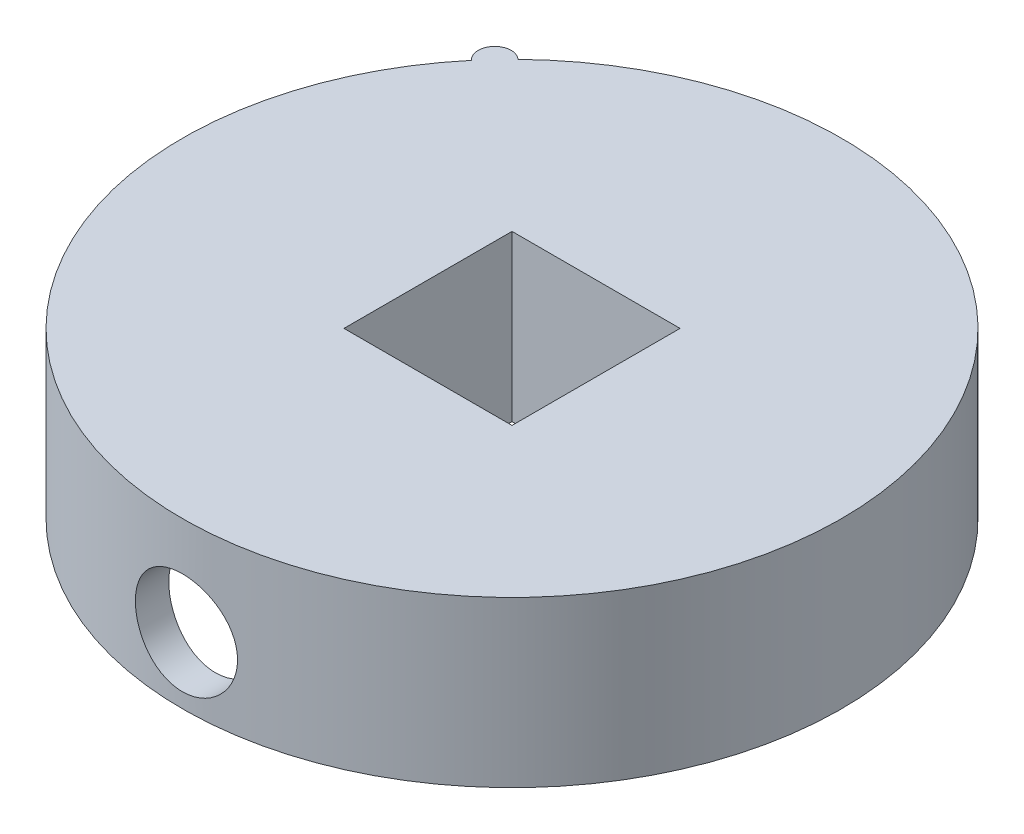
ISO-10303-21;
HEADER;
FILE_DESCRIPTION(('STEP AP214'),'2;1');
FILE_NAME('part.step','',(''),(''),'','','');
FILE_SCHEMA(('AUTOMOTIVE_DESIGN { 1 0 10303 214 1 1 1 1 }'));
ENDSEC;
DATA;
#1=APPLICATION_CONTEXT('core data for automotive mechanical design processes');
#2=APPLICATION_PROTOCOL_DEFINITION('international standard','automotive_design',2000,#1);
#3=PRODUCT_CONTEXT('',#1,'mechanical');
#4=PRODUCT('Part','Part','',(#3));
#5=PRODUCT_RELATED_PRODUCT_CATEGORY('part','',(#4));
#6=PRODUCT_DEFINITION_FORMATION('','',#4);
#7=PRODUCT_DEFINITION_CONTEXT('part definition',#1,'design');
#8=PRODUCT_DEFINITION('design','',#6,#7);
#9=PRODUCT_DEFINITION_SHAPE('','',#8);
#10=(LENGTH_UNIT() NAMED_UNIT(*) SI_UNIT(.MILLI.,.METRE.));
#11=(NAMED_UNIT(*) PLANE_ANGLE_UNIT() SI_UNIT($,.RADIAN.));
#12=(NAMED_UNIT(*) SI_UNIT($,.STERADIAN.) SOLID_ANGLE_UNIT());
#13=UNCERTAINTY_MEASURE_WITH_UNIT(LENGTH_MEASURE(1.E-05),#10,'distance_accuracy_value','');
#14=(GEOMETRIC_REPRESENTATION_CONTEXT(3) GLOBAL_UNCERTAINTY_ASSIGNED_CONTEXT((#13)) GLOBAL_UNIT_ASSIGNED_CONTEXT((#10,
#11,#12)) REPRESENTATION_CONTEXT('',''));
#15=CARTESIAN_POINT('',(0.,0.,0.));
#16=DIRECTION('',(0.,0.,1.));
#17=DIRECTION('',(1.,0.,0.));
#18=AXIS2_PLACEMENT_3D('',#15,#16,#17);
#19=CARTESIAN_POINT('',(0.,10.,0.));
#20=DIRECTION('',(0.,-1.,0.));
#21=DIRECTION('',(0.,0.,-1.));
#22=AXIS2_PLACEMENT_3D('',#19,#20,#21);
#23=CYLINDRICAL_SURFACE('',#22,20.);
#24=CARTESIAN_POINT('',(0.,10.,0.));
#25=DIRECTION('',(0.,1.,0.));
#26=DIRECTION('',(0.,0.,1.));
#27=AXIS2_PLACEMENT_3D('',#24,#25,#26);
#28=CIRCLE('',#27,20.);
#29=CARTESIAN_POINT('',(-15.3208888623795,10.,-12.8557521937308));
#30=VERTEX_POINT('',#29);
#31=CARTESIAN_POINT('',(-13.960317173332,10.,-14.3216460094491));
#32=VERTEX_POINT('',#31);
#33=EDGE_CURVE('E11',#30,#32,#28,.T.);
#34=ORIENTED_EDGE('',*,*,#33,.F.);
#35=DIRECTION('',(0.,1.,0.));
#36=VECTOR('',#35,1.);
#37=CARTESIAN_POINT('',(-15.3208888623796,-2.41380726338418,-12.8557521937307));
#38=LINE('',#37,#36);
#39=CARTESIAN_POINT('',(-15.3208888623796,0.,-12.8557521937307));
#40=VERTEX_POINT('',#39);
#41=EDGE_CURVE('E111',#40,#30,#38,.T.);
#42=ORIENTED_EDGE('',*,*,#41,.F.);
#43=CARTESIAN_POINT('',(0.,0.,0.));
#44=DIRECTION('',(0.,1.,0.));
#45=DIRECTION('',(0.,0.,1.));
#46=AXIS2_PLACEMENT_3D('',#43,#44,#45);
#47=CIRCLE('',#46,20.);
#48=CARTESIAN_POINT('',(-13.960317173332,0.,-14.3216460094491));
#49=VERTEX_POINT('',#48);
#50=EDGE_CURVE('E38',#40,#49,#47,.T.);
#51=ORIENTED_EDGE('',*,*,#50,.T.);
#52=DIRECTION('',(0.,1.,0.));
#53=VECTOR('',#52,1.);
#54=CARTESIAN_POINT('',(-13.9603171733319,-2.41380726338418,-14.3216460094492));
#55=LINE('',#54,#53);
#56=EDGE_CURVE('E52',#49,#32,#55,.T.);
#57=ORIENTED_EDGE('',*,*,#56,.T.);
#58=EDGE_LOOP('',(#34,#42,#51,#57));
#59=FACE_BOUND('',#58,.T.);
#60=CARTESIAN_POINT('',(0.,0.9,20.));
#61=CARTESIAN_POINT('',(0.173016557974578,0.900007080795432,19.9999971650391));
#62=CARTESIAN_POINT('',(0.34613178639695,0.914533455175428,19.9977314078076));
#63=CARTESIAN_POINT('',(0.687518635637837,0.972237701724927,19.9889109487694));
#64=CARTESIAN_POINT('',(0.855785454793477,1.01544302312093,19.9823521380743));
#65=CARTESIAN_POINT('',(1.18248593303596,1.1291791256332,19.9656822285072));
#66=CARTESIAN_POINT('',(1.34092709214203,1.19968875969523,19.9555738792985));
#67=CARTESIAN_POINT('',(1.64370610687182,1.36597920536802,19.9329202594809));
#68=CARTESIAN_POINT('',(1.78804581720928,1.46175668743951,19.9203753099998));
#69=CARTESIAN_POINT('',(2.05974845786461,1.67671260326108,19.8941255745019));
#70=CARTESIAN_POINT('',(2.18697707204052,1.79605986049788,19.8804128527335));
#71=CARTESIAN_POINT('',(2.4196867060257,2.05440416109371,19.85343479463));
#72=CARTESIAN_POINT('',(2.52516644076686,2.19340236474357,19.8401694847697));
#73=CARTESIAN_POINT('',(2.71191152805789,2.48801131649957,19.8155112551125));
#74=CARTESIAN_POINT('',(2.79304608511286,2.64370590555726,19.8041285915852));
#75=CARTESIAN_POINT('',(2.92796168702672,2.96671880338056,19.7846333252768));
#76=CARTESIAN_POINT('',(2.98174432506344,3.13403643448893,19.7765205320398));
#77=CARTESIAN_POINT('',(3.06001047470206,3.47412991875066,19.7645618858971));
#78=CARTESIAN_POINT('',(3.08472451807274,3.64685151766504,19.7606824776643));
#79=CARTESIAN_POINT('',(3.1048662780187,3.99403042740349,19.7575280822113));
#80=CARTESIAN_POINT('',(3.10029578872548,4.16848763124104,19.758252812916));
#81=CARTESIAN_POINT('',(3.06218643754866,4.5125521067266,19.7641941390446));
#82=CARTESIAN_POINT('',(3.02890496858939,4.68218867658666,19.7693708216034));
#83=CARTESIAN_POINT('',(2.93472161326262,5.01344040797057,19.783570384335));
#84=CARTESIAN_POINT('',(2.87381889722358,5.17505532838282,19.7925933800408));
#85=CARTESIAN_POINT('',(2.72585610559503,5.48645559505007,19.8135127113495));
#86=CARTESIAN_POINT('',(2.63868762651754,5.6361886031537,19.8254209140239));
#87=CARTESIAN_POINT('',(2.44074483457386,5.91899998169321,19.8507604280544));
#88=CARTESIAN_POINT('',(2.32996886913798,6.05207718515487,19.8641918460077));
#89=CARTESIAN_POINT('',(2.0865457846287,6.29929060689683,19.8912404778778));
#90=CARTESIAN_POINT('',(1.95367749855783,6.41320911235008,19.9048581429418));
#91=CARTESIAN_POINT('',(1.67059352836411,6.61716458384982,19.9306117241799));
#92=CARTESIAN_POINT('',(1.52037775867124,6.70720143208794,19.9427476330443));
#93=CARTESIAN_POINT('',(1.20666955981141,6.86085145308918,19.9641842572175));
#94=CARTESIAN_POINT('',(1.04316842223976,6.92444712418766,19.973483093561));
#95=CARTESIAN_POINT('',(0.707630368591965,7.02321658476251,19.9881823322231));
#96=CARTESIAN_POINT('',(0.535594070043371,7.05839242726859,19.9935830161389));
#97=CARTESIAN_POINT('',(0.18974745321463,7.09903258858386,19.999839979177));
#98=CARTESIAN_POINT('',(0.0159730895823901,7.10479609111716,20.0007420165939));
#99=CARTESIAN_POINT('',(-0.330059915144203,7.08724310983438,19.9980248327243));
#100=CARTESIAN_POINT('',(-0.5023186062509,7.06392758918426,19.9944057611877));
#101=CARTESIAN_POINT('',(-0.839519062554434,6.98912721291357,19.9830813062526));
#102=CARTESIAN_POINT('',(-1.00449408808775,6.93778880133858,19.9753971727289));
#103=CARTESIAN_POINT('',(-1.32349525981676,6.80855487063498,19.9568011840378));
#104=CARTESIAN_POINT('',(-1.4775208615223,6.73065803193059,19.9458891684944));
#105=CARTESIAN_POINT('',(-1.7715619191957,6.54982138344464,19.9219357385274));
#106=CARTESIAN_POINT('',(-1.91145985994471,6.44669262669295,19.9088785142824));
#107=CARTESIAN_POINT('',(-2.17206987835387,6.21858173575031,19.8821353568535));
#108=CARTESIAN_POINT('',(-2.29278076018428,6.09359824048571,19.8684493845514));
#109=CARTESIAN_POINT('',(-2.51268466926641,5.82399085535137,19.8418452953327));
#110=CARTESIAN_POINT('',(-2.61167667299673,5.67920210042096,19.8289350943909));
#111=CARTESIAN_POINT('',(-2.78393359428538,5.37487547615815,19.805486686096));
#112=CARTESIAN_POINT('',(-2.85719924335206,5.21533802635611,19.7949484113023));
#113=CARTESIAN_POINT('',(-2.97561529141455,4.88663129933381,19.7774949611492));
#114=CARTESIAN_POINT('',(-3.02086981632308,4.71750027657163,19.7705663828432));
#115=CARTESIAN_POINT('',(-3.08230938314147,4.37392249209178,19.7610817453396));
#116=CARTESIAN_POINT('',(-3.09849658118311,4.1994761256275,19.7585253618258));
#117=CARTESIAN_POINT('',(-3.10128813555182,3.85222422779024,19.7580872149381));
#118=CARTESIAN_POINT('',(-3.08820865954259,3.67942121854002,19.7601554912251));
#119=CARTESIAN_POINT('',(-3.03351744801726,3.33850471906413,19.7686247773595));
#120=CARTESIAN_POINT('',(-2.99190577093735,3.17039121923471,19.7750257783332));
#121=CARTESIAN_POINT('',(-2.88144589881863,2.84372354234137,19.791421373363));
#122=CARTESIAN_POINT('',(-2.81262129276619,2.68516122283937,19.801412854401));
#123=CARTESIAN_POINT('',(-2.64972096024408,2.3817828432796,19.8238671717296));
#124=CARTESIAN_POINT('',(-2.55564426248003,2.23696731226727,19.836330103077));
#125=CARTESIAN_POINT('',(-2.34376738116094,1.96358948224111,19.862483054043));
#126=CARTESIAN_POINT('',(-2.22573346513276,1.83520939110733,19.876184362017));
#127=CARTESIAN_POINT('',(-1.96978661876277,1.59996736742,19.903177261943));
#128=CARTESIAN_POINT('',(-1.8318690851942,1.49311043142968,19.9164687581527));
#129=CARTESIAN_POINT('',(-1.53910930505027,1.30338057555414,19.9412344524066));
#130=CARTESIAN_POINT('',(-1.38417199504349,1.22065289513756,19.9526974646132));
#131=CARTESIAN_POINT('',(-1.06249346622742,1.08252095182279,19.9724052696854));
#132=CARTESIAN_POINT('',(-0.895764538907991,1.02708870280286,19.9806533570105));
#133=CARTESIAN_POINT('',(-0.606929877005346,0.957540053066292,19.9911430658503));
#134=CARTESIAN_POINT('',(-0.486597179715198,0.935995962038425,19.9944471586378));
#135=CARTESIAN_POINT('',(-0.244192691603641,0.907223534809589,19.9988766112674));
#136=CARTESIAN_POINT('',(-0.122120924673141,0.899995002135659,20.000002001011));
#137=CARTESIAN_POINT('',(0.,0.9,20.));
#138=B_SPLINE_CURVE_WITH_KNOTS('',3,(#60,#61,#62,#63,#64,#65,#66,#67,#68,#69,#70,#71,#72,#73,
#74,#75,#76,#77,#78,#79,#80,#81,#82,#83,#84,#85,#86,#87,#88,#89,#90,#91,#92,#93,#94,#95,#96,#97,
#98,#99,#100,#101,#102,#103,#104,#105,#106,#107,#108,#109,#110,#111,#112,#113,#114,#115,#116,
#117,#118,#119,#120,#121,#122,#123,#124,#125,#126,#127,#128,#129,#130,#131,#132,#133,#134,#135,
#136,#137),.UNSPECIFIED.,.T.,.F.,(4,2,2,2,2,2,2,2,2,2,2,2,2,2,2,2,2,2,2,2,2,2,2,2,2,2,2,2,2,2,2,
2,2,2,2,2,2,2,4),(0.,0.518603389696483,1.03770386276341,1.55640309660684,2.07503401566504,
2.59752406878385,3.12004498524092,3.64532487300955,4.17057416109137,4.69162919625163,
5.21265230902045,5.72905244255467,6.24546808845431,6.76404496609117,7.28265815704321,
7.80681594553428,8.33097631965123,8.85548309023761,9.3799519674113,9.89907513525496,
10.4181811089692,10.9345999175123,11.4510443884596,11.9714813947096,12.4919508243877,
13.0170514007104,13.5421370450079,14.0652588749373,14.5883418995712,15.105801374666,
15.6232597899663,16.1402706366429,16.6573013724327,17.1796423654186,17.7021044795559,
18.2276494116379,18.7526543724209,19.1187071678768,19.4847549394298),.UNSPECIFIED.);
#139=CARTESIAN_POINT('',(0.,0.9,20.));
#140=VERTEX_POINT('',#139);
#141=EDGE_CURVE('E122',#140,#140,#138,.T.);
#142=ORIENTED_EDGE('',*,*,#141,.F.);
#143=EDGE_LOOP('',(#142));
#144=FACE_BOUND('',#143,.T.);
#145=ADVANCED_FACE('F34',(#59,#144),#23,.T.);
#146=CARTESIAN_POINT('',(0.,10.,0.));
#147=DIRECTION('',(0.,-1.,0.));
#148=DIRECTION('',(0.,0.,-1.));
#149=AXIS2_PLACEMENT_3D('',#146,#147,#148);
#150=CYLINDRICAL_SURFACE('',#149,18.);
#151=CARTESIAN_POINT('',(0.,0.,0.));
#152=DIRECTION('',(0.,1.,0.));
#153=DIRECTION('',(0.,0.,1.));
#154=AXIS2_PLACEMENT_3D('',#151,#152,#153);
#155=CIRCLE('',#154,18.);
#156=CARTESIAN_POINT('',(0.,0.,18.));
#157=VERTEX_POINT('',#156);
#158=EDGE_CURVE('E161',#157,#157,#155,.T.);
#159=ORIENTED_EDGE('',*,*,#158,.F.);
#160=EDGE_LOOP('',(#159));
#161=FACE_BOUND('',#160,.T.);
#162=CARTESIAN_POINT('',(0.,8.,0.));
#163=DIRECTION('',(0.,1.,0.));
#164=DIRECTION('',(0.,0.,1.));
#165=AXIS2_PLACEMENT_3D('',#162,#163,#164);
#166=CIRCLE('',#165,18.);
#167=CARTESIAN_POINT('',(0.,8.,18.));
#168=VERTEX_POINT('',#167);
#169=EDGE_CURVE('E165',#168,#168,#166,.T.);
#170=ORIENTED_EDGE('',*,*,#169,.T.);
#171=EDGE_LOOP('',(#170));
#172=FACE_BOUND('',#171,.T.);
#173=CARTESIAN_POINT('',(-3.1,4.,17.7310462184272));
#174=CARTESIAN_POINT('',(-3.09999313298625,3.82726272069094,17.7310494042664));
#175=CARTESIAN_POINT('',(-3.08551325830219,3.65443324166269,17.73359781963));
#176=CARTESIAN_POINT('',(-3.02800504284677,3.3136297172631,17.7435059787685));
#177=CARTESIAN_POINT('',(-2.98495091441744,3.14566020093493,17.7508700684992));
#178=CARTESIAN_POINT('',(-2.87164044523443,2.81955782532416,17.7695513490921));
#179=CARTESIAN_POINT('',(-2.80140750244069,2.66141664047294,17.7808651388806));
#180=CARTESIAN_POINT('',(-2.63579233362493,2.35917772393653,17.8061670210701));
#181=CARTESIAN_POINT('',(-2.54041271452993,2.21507853865303,17.8201548362166));
#182=CARTESIAN_POINT('',(-2.32614184855305,1.94348302334085,17.8493930596395));
#183=CARTESIAN_POINT('',(-2.20703766109128,1.81615581205768,17.8646541168498));
#184=CARTESIAN_POINT('',(-1.94915880252542,1.58318869594025,17.8946248323828));
#185=CARTESIAN_POINT('',(-1.8103829352717,1.47755011085444,17.9093344571066));
#186=CARTESIAN_POINT('',(-1.51600028932563,1.29032070282335,17.936657998033));
#187=CARTESIAN_POINT('',(-1.36029165213239,1.20888781717709,17.9492579257511));
#188=CARTESIAN_POINT('',(-1.03715174208675,1.07339715212286,17.9708237164532));
#189=CARTESIAN_POINT('',(-0.869721283594248,1.01933747313718,17.979789831599));
#190=CARTESIAN_POINT('',(-0.529639199316319,0.94064653169822,17.9930025721505));
#191=CARTESIAN_POINT('',(-0.35705518468448,0.91573085034474,17.9972947816215));
#192=CARTESIAN_POINT('',(-0.0101065543135215,0.89515029007298,18.0008328399529));
#193=CARTESIAN_POINT('',(0.164257931654621,0.899483294323953,18.0000790540098));
#194=CARTESIAN_POINT('',(0.507871793120614,0.9370562397458,17.9936460189792));
#195=CARTESIAN_POINT('',(0.677155759346085,0.969990051732044,17.988018933082));
#196=CARTESIAN_POINT('',(1.00775822133334,1.06334715589263,17.9725297958012));
#197=CARTESIAN_POINT('',(1.16907646161652,1.12377132911018,17.9626676086866));
#198=CARTESIAN_POINT('',(1.48007290317722,1.27069494452743,17.9397279725034));
#199=CARTESIAN_POINT('',(1.62969078748866,1.35731956202935,17.9266351452942));
#200=CARTESIAN_POINT('',(1.91238214853264,1.5540932748335,17.898687174683));
#201=CARTESIAN_POINT('',(2.04545419633083,1.66424439970646,17.8838318792866));
#202=CARTESIAN_POINT('',(2.29308650989974,1.90663949916695,17.8537823097114));
#203=CARTESIAN_POINT('',(2.40738472323858,2.03915111084635,17.838586137045));
#204=CARTESIAN_POINT('',(2.61216854846296,2.32160652946511,17.8097530244593));
#205=CARTESIAN_POINT('',(2.70265391082531,2.47155051904609,17.7961161008794));
#206=CARTESIAN_POINT('',(2.85730087370296,2.78492932747192,17.7719440497841));
#207=CARTESIAN_POINT('',(2.92142926062609,2.94838085830812,17.7614128406061));
#208=CARTESIAN_POINT('',(3.02124489556565,3.28395857625857,17.7447080955585));
#209=CARTESIAN_POINT('',(3.05693482896464,3.45608394268864,17.7385341482481));
#210=CARTESIAN_POINT('',(3.09848798719902,3.80177395904009,17.7313230529256));
#211=CARTESIAN_POINT('',(3.10472551762942,3.9752923138647,17.7302214459032));
#212=CARTESIAN_POINT('',(3.08819578605888,4.32089297696119,17.7331078649149));
#213=CARTESIAN_POINT('',(3.06542972381246,4.49297534433735,17.7370956804214));
#214=CARTESIAN_POINT('',(2.99185875873464,4.82961966631278,17.7496519386929));
#215=CARTESIAN_POINT('',(2.94124583341696,4.99422485025197,17.7581890061732));
#216=CARTESIAN_POINT('',(2.81361979825464,5.31261748550005,17.7788553503244));
#217=CARTESIAN_POINT('',(2.73660501354011,5.46640424976855,17.7909848548842));
#218=CARTESIAN_POINT('',(2.55748363807944,5.76045617285387,17.8176183967342));
#219=CARTESIAN_POINT('',(2.45513805299021,5.90057370577815,17.8321445840279));
#220=CARTESIAN_POINT('',(2.22858683964253,6.16178043077467,17.8618706165594));
#221=CARTESIAN_POINT('',(2.10437956531447,6.28286818870502,17.8770705124594));
#222=CARTESIAN_POINT('',(1.83596895921044,6.50395300395085,17.9066360445248));
#223=CARTESIAN_POINT('',(1.6915581469289,6.60369989266837,17.9209904913054));
#224=CARTESIAN_POINT('',(1.38781145578617,6.77751584823228,17.9470660891861));
#225=CARTESIAN_POINT('',(1.2284760847549,6.8515857883715,17.9587873298389));
#226=CARTESIAN_POINT('',(0.900133060857951,6.97155973486499,17.9782273472964));
#227=CARTESIAN_POINT('',(0.731173614747658,7.0175925824532,17.9859644071876));
#228=CARTESIAN_POINT('',(0.387777506000827,7.08059964069153,17.996641785183));
#229=CARTESIAN_POINT('',(0.213341327330556,7.09757641164158,17.9995825259176));
#230=CARTESIAN_POINT('',(-0.133646085689154,7.10191176659875,18.0003293291214));
#231=CARTESIAN_POINT('',(-0.306192548851938,7.08965025784471,17.9982012535989));
#232=CARTESIAN_POINT('',(-0.646729000742405,7.03668147658913,17.9891845992446));
#233=CARTESIAN_POINT('',(-0.814719019304073,6.99597439038589,17.9822960515906));
#234=CARTESIAN_POINT('',(-1.14121455109152,6.88741952012266,17.9645302874585));
#235=CARTESIAN_POINT('',(-1.29973179471327,6.81960613815113,17.9536581282528));
#236=CARTESIAN_POINT('',(-1.60319648346798,6.65880671706889,17.9291094270097));
#237=CARTESIAN_POINT('',(-1.74814321499517,6.5658193551832,17.9154327376165));
#238=CARTESIAN_POINT('',(-2.02226104621523,6.35597463562083,17.8865791500137));
#239=CARTESIAN_POINT('',(-2.1512181870935,6.23883999122012,17.8713859895924));
#240=CARTESIAN_POINT('',(-2.38777968814283,5.98460626618822,17.8413218089942));
#241=CARTESIAN_POINT('',(-2.49537903835792,5.84750251439415,17.8264508651275));
#242=CARTESIAN_POINT('',(-2.68692820643402,5.55598003634335,17.7985921888736));
#243=CARTESIAN_POINT('',(-2.77069172773889,5.40143742750927,17.7856196566342));
#244=CARTESIAN_POINT('',(-2.91093883284905,5.08031080000741,17.7632069636885));
#245=CARTESIAN_POINT('',(-2.96744928842572,4.9137388295448,17.7537633255382));
#246=CARTESIAN_POINT('',(-3.03951297941637,4.62213034763268,17.7415403224668));
#247=CARTESIAN_POINT('',(-3.06215859815304,4.49884552094047,17.7376272886697));
#248=CARTESIAN_POINT('',(-3.09240444505106,4.25038992086438,17.7323791080338));
#249=CARTESIAN_POINT('',(-3.10000497797507,4.12521918573439,17.7310439089767));
#250=CARTESIAN_POINT('',(-3.1,4.,17.7310462184272));
#251=B_SPLINE_CURVE_WITH_KNOTS('',3,(#173,#174,#175,#176,#177,#178,#179,#180,#181,#182,#183,
#184,#185,#186,#187,#188,#189,#190,#191,#192,#193,#194,#195,#196,#197,#198,#199,#200,#201,#202,
#203,#204,#205,#206,#207,#208,#209,#210,#211,#212,#213,#214,#215,#216,#217,#218,#219,#220,#221,
#222,#223,#224,#225,#226,#227,#228,#229,#230,#231,#232,#233,#234,#235,#236,#237,#238,#239,#240,
#241,#242,#243,#244,#245,#246,#247,#248,#249,#250),.UNSPECIFIED.,.T.,.F.,(4,2,2,2,2,2,2,2,2,2,2,
2,2,2,2,2,2,2,2,2,2,2,2,2,2,2,2,2,2,2,2,2,2,2,2,2,2,2,4),(0.,0.517753850761574,1.03597559993478,
1.55375220630103,2.07147515645401,2.59407326128228,3.11670315667935,3.64267180628803,
4.16860395102849,4.68935948381991,5.21007732809709,5.72528941141336,6.24051800801167,
6.75824812295139,7.27602291917712,7.80050309565845,8.32498876769148,8.85013335577677,
9.37522834969941,9.89363170722258,10.4120136213134,10.9268657713359,11.4417505883749,
11.961692000747,12.4816725787187,13.0074499206043,13.5332093786423,14.0565341726182,
14.5798128510276,15.0963294394443,15.6128426450766,16.128702386328,16.6445892388609,
17.1667678336015,17.6890687728398,18.2153463288493,18.7411039040315,19.1164370642766,
19.4917626214611),.UNSPECIFIED.);
#252=CARTESIAN_POINT('',(-3.1,4.,17.7310462184272));
#253=VERTEX_POINT('',#252);
#254=EDGE_CURVE('E119',#253,#253,#251,.T.);
#255=ORIENTED_EDGE('',*,*,#254,.T.);
#256=EDGE_LOOP('',(#255));
#257=FACE_BOUND('',#256,.T.);
#258=ADVANCED_FACE('F134',(#161,#172,#257),#150,.F.);
#259=CARTESIAN_POINT('',(0.,0.,0.));
#260=DIRECTION('',(0.,1.,0.));
#261=DIRECTION('',(0.,0.,1.));
#262=AXIS2_PLACEMENT_3D('',#259,#260,#261);
#263=PLANE('',#262);
#264=DIRECTION('',(0.,0.,-1.));
#265=VECTOR('',#264,1.);
#266=CARTESIAN_POINT('',(-7.1,0.,5.1));
#267=LINE('',#266,#265);
#268=CARTESIAN_POINT('',(-7.1,0.,7.1));
#269=VERTEX_POINT('',#268);
#270=CARTESIAN_POINT('',(-7.1,0.,-7.1));
#271=VERTEX_POINT('',#270);
#272=EDGE_CURVE('E170',#269,#271,#267,.T.);
#273=ORIENTED_EDGE('',*,*,#272,.T.);
#274=DIRECTION('',(1.,0.,0.));
#275=VECTOR('',#274,1.);
#276=CARTESIAN_POINT('',(5.1,0.,-7.1));
#277=LINE('',#276,#275);
#278=CARTESIAN_POINT('',(7.1,0.,-7.1));
#279=VERTEX_POINT('',#278);
#280=EDGE_CURVE('E172',#271,#279,#277,.T.);
#281=ORIENTED_EDGE('',*,*,#280,.T.);
#282=DIRECTION('',(0.,0.,1.));
#283=VECTOR('',#282,1.);
#284=CARTESIAN_POINT('',(7.1,0.,5.1));
#285=LINE('',#284,#283);
#286=CARTESIAN_POINT('',(7.1,0.,7.1));
#287=VERTEX_POINT('',#286);
#288=EDGE_CURVE('E177',#279,#287,#285,.T.);
#289=ORIENTED_EDGE('',*,*,#288,.T.);
#290=DIRECTION('',(-1.,0.,0.));
#291=VECTOR('',#290,1.);
#292=CARTESIAN_POINT('',(5.1,0.,7.1));
#293=LINE('',#292,#291);
#294=EDGE_CURVE('E182',#287,#269,#293,.T.);
#295=ORIENTED_EDGE('',*,*,#294,.T.);
#296=EDGE_LOOP('',(#273,#281,#289,#295));
#297=FACE_BOUND('',#296,.T.);
#298=DIRECTION('',(1.,0.,0.));
#299=VECTOR('',#298,1.);
#300=CARTESIAN_POINT('',(5.1,0.,-5.1));
#301=LINE('',#300,#299);
#302=CARTESIAN_POINT('',(-5.1,0.,-5.1));
#303=VERTEX_POINT('',#302);
#304=CARTESIAN_POINT('',(5.1,0.,-5.1));
#305=VERTEX_POINT('',#304);
#306=EDGE_CURVE('E203',#303,#305,#301,.T.);
#307=ORIENTED_EDGE('',*,*,#306,.F.);
#308=DIRECTION('',(0.,0.,-1.));
#309=VECTOR('',#308,1.);
#310=CARTESIAN_POINT('',(-5.1,0.,5.1));
#311=LINE('',#310,#309);
#312=CARTESIAN_POINT('',(-5.1,0.,5.1));
#313=VERTEX_POINT('',#312);
#314=EDGE_CURVE('E201',#313,#303,#311,.T.);
#315=ORIENTED_EDGE('',*,*,#314,.F.);
#316=DIRECTION('',(-1.,0.,0.));
#317=VECTOR('',#316,1.);
#318=CARTESIAN_POINT('',(5.1,0.,5.1));
#319=LINE('',#318,#317);
#320=CARTESIAN_POINT('',(5.1,0.,5.1));
#321=VERTEX_POINT('',#320);
#322=EDGE_CURVE('E191',#321,#313,#319,.T.);
#323=ORIENTED_EDGE('',*,*,#322,.F.);
#324=DIRECTION('',(0.,0.,1.));
#325=VECTOR('',#324,1.);
#326=CARTESIAN_POINT('',(5.1,0.,5.1));
#327=LINE('',#326,#325);
#328=EDGE_CURVE('E206',#305,#321,#327,.T.);
#329=ORIENTED_EDGE('',*,*,#328,.F.);
#330=EDGE_LOOP('',(#307,#315,#323,#329));
#331=FACE_BOUND('',#330,.T.);
#332=ADVANCED_FACE('F151',(#297,#331),#263,.F.);
#333=CARTESIAN_POINT('',(0.,10.,0.));
#334=DIRECTION('',(0.,1.,0.));
#335=DIRECTION('',(0.,0.,1.));
#336=AXIS2_PLACEMENT_3D('',#333,#334,#335);
#337=PLANE('',#336);
#338=ORIENTED_EDGE('',*,*,#33,.T.);
#339=CARTESIAN_POINT('',(-14.6406030178558,10.,-13.58869910159));
#340=DIRECTION('',(0.,1.,0.));
#341=DIRECTION('',(0.,0.,-1.));
#342=AXIS2_PLACEMENT_3D('',#339,#340,#341);
#343=CIRCLE('',#342,1.);
#344=EDGE_CURVE('E116',#32,#30,#343,.T.);
#345=ORIENTED_EDGE('',*,*,#344,.T.);
#346=EDGE_LOOP('',(#338,#345));
#347=FACE_BOUND('',#346,.T.);
#348=DIRECTION('',(0.,0.,-1.));
#349=VECTOR('',#348,1.);
#350=CARTESIAN_POINT('',(-5.1,10.,5.1));
#351=LINE('',#350,#349);
#352=CARTESIAN_POINT('',(-5.1,10.,5.1));
#353=VERTEX_POINT('',#352);
#354=CARTESIAN_POINT('',(-5.1,10.,-5.1));
#355=VERTEX_POINT('',#354);
#356=EDGE_CURVE('E187',#353,#355,#351,.T.);
#357=ORIENTED_EDGE('',*,*,#356,.T.);
#358=DIRECTION('',(1.,0.,0.));
#359=VECTOR('',#358,1.);
#360=CARTESIAN_POINT('',(5.1,10.,-5.1));
#361=LINE('',#360,#359);
#362=CARTESIAN_POINT('',(5.1,10.,-5.1));
#363=VERTEX_POINT('',#362);
#364=EDGE_CURVE('E190',#355,#363,#361,.T.);
#365=ORIENTED_EDGE('',*,*,#364,.T.);
#366=DIRECTION('',(0.,0.,1.));
#367=VECTOR('',#366,1.);
#368=CARTESIAN_POINT('',(5.1,10.,5.1));
#369=LINE('',#368,#367);
#370=CARTESIAN_POINT('',(5.1,10.,5.1));
#371=VERTEX_POINT('',#370);
#372=EDGE_CURVE('E194',#363,#371,#369,.T.);
#373=ORIENTED_EDGE('',*,*,#372,.T.);
#374=DIRECTION('',(-1.,0.,0.));
#375=VECTOR('',#374,1.);
#376=CARTESIAN_POINT('',(5.1,10.,5.1));
#377=LINE('',#376,#375);
#378=EDGE_CURVE('E197',#371,#353,#377,.T.);
#379=ORIENTED_EDGE('',*,*,#378,.T.);
#380=EDGE_LOOP('',(#357,#365,#373,#379));
#381=FACE_BOUND('',#380,.T.);
#382=ADVANCED_FACE('F156',(#347,#381),#337,.T.);
#383=ORIENTED_EDGE('',*,*,#158,.T.);
#384=EDGE_LOOP('',(#383));
#385=FACE_BOUND('',#384,.T.);
#386=ORIENTED_EDGE('',*,*,#50,.F.);
#387=CARTESIAN_POINT('',(-14.6406030178558,0.,-13.58869910159));
#388=DIRECTION('',(0.,1.,0.));
#389=DIRECTION('',(0.,0.,1.));
#390=AXIS2_PLACEMENT_3D('',#387,#388,#389);
#391=CIRCLE('',#390,1.);
#392=EDGE_CURVE('E109',#40,#49,#391,.F.);
#393=ORIENTED_EDGE('',*,*,#392,.T.);
#394=EDGE_LOOP('',(#386,#393));
#395=FACE_BOUND('',#394,.T.);
#396=ADVANCED_FACE('F107',(#385,#395),#263,.F.);
#397=CARTESIAN_POINT('',(-5.1,10.,5.1));
#398=DIRECTION('',(-1.,0.,0.));
#399=DIRECTION('',(0.,0.,1.));
#400=AXIS2_PLACEMENT_3D('',#397,#398,#399);
#401=PLANE('',#400);
#402=ORIENTED_EDGE('',*,*,#314,.T.);
#403=DIRECTION('',(0.,-1.,0.));
#404=VECTOR('',#403,1.);
#405=CARTESIAN_POINT('',(-5.1,10.,-5.1));
#406=LINE('',#405,#404);
#407=EDGE_CURVE('E200',#355,#303,#406,.T.);
#408=ORIENTED_EDGE('',*,*,#407,.F.);
#409=ORIENTED_EDGE('',*,*,#356,.F.);
#410=DIRECTION('',(0.,-1.,0.));
#411=VECTOR('',#410,1.);
#412=CARTESIAN_POINT('',(-5.1,10.,5.1));
#413=LINE('',#412,#411);
#414=EDGE_CURVE('E110',#353,#313,#413,.T.);
#415=ORIENTED_EDGE('',*,*,#414,.T.);
#416=EDGE_LOOP('',(#402,#408,#409,#415));
#417=FACE_BOUND('',#416,.T.);
#418=ADVANCED_FACE('F232',(#417),#401,.F.);
#419=CARTESIAN_POINT('',(5.1,10.,5.1));
#420=DIRECTION('',(0.,0.,1.));
#421=DIRECTION('',(1.,0.,0.));
#422=AXIS2_PLACEMENT_3D('',#419,#420,#421);
#423=PLANE('',#422);
#424=ORIENTED_EDGE('',*,*,#322,.T.);
#425=ORIENTED_EDGE('',*,*,#414,.F.);
#426=ORIENTED_EDGE('',*,*,#378,.F.);
#427=DIRECTION('',(0.,-1.,0.));
#428=VECTOR('',#427,1.);
#429=CARTESIAN_POINT('',(5.1,10.,5.1));
#430=LINE('',#429,#428);
#431=EDGE_CURVE('E212',#371,#321,#430,.T.);
#432=ORIENTED_EDGE('',*,*,#431,.T.);
#433=EDGE_LOOP('',(#424,#425,#426,#432));
#434=FACE_BOUND('',#433,.T.);
#435=ADVANCED_FACE('F234',(#434),#423,.F.);
#436=CARTESIAN_POINT('',(5.1,10.,5.1));
#437=DIRECTION('',(1.,0.,0.));
#438=DIRECTION('',(0.,0.,-1.));
#439=AXIS2_PLACEMENT_3D('',#436,#437,#438);
#440=PLANE('',#439);
#441=ORIENTED_EDGE('',*,*,#328,.T.);
#442=ORIENTED_EDGE('',*,*,#431,.F.);
#443=ORIENTED_EDGE('',*,*,#372,.F.);
#444=DIRECTION('',(0.,-1.,0.));
#445=VECTOR('',#444,1.);
#446=CARTESIAN_POINT('',(5.1,10.,-5.1));
#447=LINE('',#446,#445);
#448=EDGE_CURVE('E214',#363,#305,#447,.T.);
#449=ORIENTED_EDGE('',*,*,#448,.T.);
#450=EDGE_LOOP('',(#441,#442,#443,#449));
#451=FACE_BOUND('',#450,.T.);
#452=ADVANCED_FACE('F229',(#451),#440,.F.);
#453=CARTESIAN_POINT('',(5.1,10.,-5.1));
#454=DIRECTION('',(0.,0.,-1.));
#455=DIRECTION('',(-1.,0.,0.));
#456=AXIS2_PLACEMENT_3D('',#453,#454,#455);
#457=PLANE('',#456);
#458=ORIENTED_EDGE('',*,*,#306,.T.);
#459=ORIENTED_EDGE('',*,*,#448,.F.);
#460=ORIENTED_EDGE('',*,*,#364,.F.);
#461=ORIENTED_EDGE('',*,*,#407,.T.);
#462=EDGE_LOOP('',(#458,#459,#460,#461));
#463=FACE_BOUND('',#462,.T.);
#464=ADVANCED_FACE('F220',(#463),#457,.F.);
#465=CARTESIAN_POINT('',(0.,8.,0.));
#466=DIRECTION('',(0.,1.,0.));
#467=DIRECTION('',(0.,0.,1.));
#468=AXIS2_PLACEMENT_3D('',#465,#466,#467);
#469=PLANE('',#468);
#470=DIRECTION('',(0.,0.,-1.));
#471=VECTOR('',#470,1.);
#472=CARTESIAN_POINT('',(-7.1,8.,5.1));
#473=LINE('',#472,#471);
#474=CARTESIAN_POINT('',(-7.1,8.,7.1));
#475=VERTEX_POINT('',#474);
#476=CARTESIAN_POINT('',(-7.1,8.,-7.1));
#477=VERTEX_POINT('',#476);
#478=EDGE_CURVE('E184',#475,#477,#473,.T.);
#479=ORIENTED_EDGE('',*,*,#478,.F.);
#480=DIRECTION('',(-1.,0.,0.));
#481=VECTOR('',#480,1.);
#482=CARTESIAN_POINT('',(5.1,8.,7.1));
#483=LINE('',#482,#481);
#484=CARTESIAN_POINT('',(7.1,8.,7.1));
#485=VERTEX_POINT('',#484);
#486=EDGE_CURVE('E271',#485,#475,#483,.T.);
#487=ORIENTED_EDGE('',*,*,#486,.F.);
#488=DIRECTION('',(0.,0.,1.));
#489=VECTOR('',#488,1.);
#490=CARTESIAN_POINT('',(7.1,8.,5.1));
#491=LINE('',#490,#489);
#492=CARTESIAN_POINT('',(7.1,8.,-7.1));
#493=VERTEX_POINT('',#492);
#494=EDGE_CURVE('E274',#493,#485,#491,.T.);
#495=ORIENTED_EDGE('',*,*,#494,.F.);
#496=DIRECTION('',(1.,0.,0.));
#497=VECTOR('',#496,1.);
#498=CARTESIAN_POINT('',(5.1,8.,-7.1));
#499=LINE('',#498,#497);
#500=EDGE_CURVE('E277',#477,#493,#499,.T.);
#501=ORIENTED_EDGE('',*,*,#500,.F.);
#502=EDGE_LOOP('',(#479,#487,#495,#501));
#503=FACE_BOUND('',#502,.T.);
#504=ORIENTED_EDGE('',*,*,#169,.F.);
#505=EDGE_LOOP('',(#504));
#506=FACE_BOUND('',#505,.T.);
#507=ADVANCED_FACE('F247',(#503,#506),#469,.F.);
#508=CARTESIAN_POINT('',(-7.1,10.,5.1));
#509=DIRECTION('',(-1.,0.,0.));
#510=DIRECTION('',(0.,0.,1.));
#511=AXIS2_PLACEMENT_3D('',#508,#509,#510);
#512=PLANE('',#511);
#513=ORIENTED_EDGE('',*,*,#272,.F.);
#514=DIRECTION('',(0.,-1.,0.));
#515=VECTOR('',#514,1.);
#516=CARTESIAN_POINT('',(-7.1,10.,7.1));
#517=LINE('',#516,#515);
#518=EDGE_CURVE('E255',#475,#269,#517,.T.);
#519=ORIENTED_EDGE('',*,*,#518,.F.);
#520=ORIENTED_EDGE('',*,*,#478,.T.);
#521=DIRECTION('',(0.,-1.,0.));
#522=VECTOR('',#521,1.);
#523=CARTESIAN_POINT('',(-7.1,10.,-7.1));
#524=LINE('',#523,#522);
#525=EDGE_CURVE('E264',#477,#271,#524,.T.);
#526=ORIENTED_EDGE('',*,*,#525,.T.);
#527=EDGE_LOOP('',(#513,#519,#520,#526));
#528=FACE_BOUND('',#527,.T.);
#529=ADVANCED_FACE('F282',(#528),#512,.T.);
#530=CARTESIAN_POINT('',(5.1,10.,7.1));
#531=DIRECTION('',(0.,0.,1.));
#532=DIRECTION('',(1.,0.,0.));
#533=AXIS2_PLACEMENT_3D('',#530,#531,#532);
#534=PLANE('',#533);
#535=ORIENTED_EDGE('',*,*,#294,.F.);
#536=DIRECTION('',(0.,-1.,0.));
#537=VECTOR('',#536,1.);
#538=CARTESIAN_POINT('',(7.1,10.,7.1));
#539=LINE('',#538,#537);
#540=EDGE_CURVE('E256',#485,#287,#539,.T.);
#541=ORIENTED_EDGE('',*,*,#540,.F.);
#542=ORIENTED_EDGE('',*,*,#486,.T.);
#543=ORIENTED_EDGE('',*,*,#518,.T.);
#544=EDGE_LOOP('',(#535,#541,#542,#543));
#545=FACE_BOUND('',#544,.T.);
#546=ADVANCED_FACE('F288',(#545),#534,.T.);
#547=CARTESIAN_POINT('',(7.1,10.,5.1));
#548=DIRECTION('',(1.,0.,0.));
#549=DIRECTION('',(0.,0.,-1.));
#550=AXIS2_PLACEMENT_3D('',#547,#548,#549);
#551=PLANE('',#550);
#552=ORIENTED_EDGE('',*,*,#288,.F.);
#553=DIRECTION('',(0.,-1.,0.));
#554=VECTOR('',#553,1.);
#555=CARTESIAN_POINT('',(7.1,10.,-7.1));
#556=LINE('',#555,#554);
#557=EDGE_CURVE('E261',#493,#279,#556,.T.);
#558=ORIENTED_EDGE('',*,*,#557,.F.);
#559=ORIENTED_EDGE('',*,*,#494,.T.);
#560=ORIENTED_EDGE('',*,*,#540,.T.);
#561=EDGE_LOOP('',(#552,#558,#559,#560));
#562=FACE_BOUND('',#561,.T.);
#563=ADVANCED_FACE('F287',(#562),#551,.T.);
#564=CARTESIAN_POINT('',(5.1,10.,-7.1));
#565=DIRECTION('',(0.,0.,-1.));
#566=DIRECTION('',(-1.,0.,0.));
#567=AXIS2_PLACEMENT_3D('',#564,#565,#566);
#568=PLANE('',#567);
#569=ORIENTED_EDGE('',*,*,#280,.F.);
#570=ORIENTED_EDGE('',*,*,#525,.F.);
#571=ORIENTED_EDGE('',*,*,#500,.T.);
#572=ORIENTED_EDGE('',*,*,#557,.T.);
#573=EDGE_LOOP('',(#569,#570,#571,#572));
#574=FACE_BOUND('',#573,.T.);
#575=ADVANCED_FACE('F141',(#574),#568,.T.);
#576=CARTESIAN_POINT('',(0.,4.,20.));
#577=DIRECTION('',(0.,0.,-1.));
#578=DIRECTION('',(-1.,0.,0.));
#579=AXIS2_PLACEMENT_3D('',#576,#577,#578);
#580=CYLINDRICAL_SURFACE('',#579,3.1);
#581=ORIENTED_EDGE('',*,*,#254,.F.);
#582=EDGE_LOOP('',(#581));
#583=FACE_BOUND('',#582,.T.);
#584=ORIENTED_EDGE('',*,*,#141,.T.);
#585=EDGE_LOOP('',(#584));
#586=FACE_BOUND('',#585,.T.);
#587=ADVANCED_FACE('F137',(#583,#586),#580,.F.);
#588=CARTESIAN_POINT('',(-14.6406030178558,-2.41380726338418,-13.58869910159));
#589=DIRECTION('',(0.,1.,0.));
#590=DIRECTION('',(0.,0.,1.));
#591=AXIS2_PLACEMENT_3D('',#588,#589,#590);
#592=CYLINDRICAL_SURFACE('',#591,1.);
#593=ORIENTED_EDGE('',*,*,#392,.F.);
#594=ORIENTED_EDGE('',*,*,#41,.T.);
#595=ORIENTED_EDGE('',*,*,#344,.F.);
#596=ORIENTED_EDGE('',*,*,#56,.F.);
#597=EDGE_LOOP('',(#593,#594,#595,#596));
#598=FACE_BOUND('',#597,.T.);
#599=ADVANCED_FACE('F118',(#598),#592,.T.);
#600=CLOSED_SHELL('',(#145,#258,#332,#382,#396,#418,#435,#452,#464,#507,#529,#546,#563,#575,
#587,#599));
#601=MANIFOLD_SOLID_BREP('B2',#600);
#602=ADVANCED_BREP_SHAPE_REPRESENTATION('',(#18,#601),#14);
#603=SHAPE_DEFINITION_REPRESENTATION(#9,#602);
ENDSEC;
END-ISO-10303-21;
